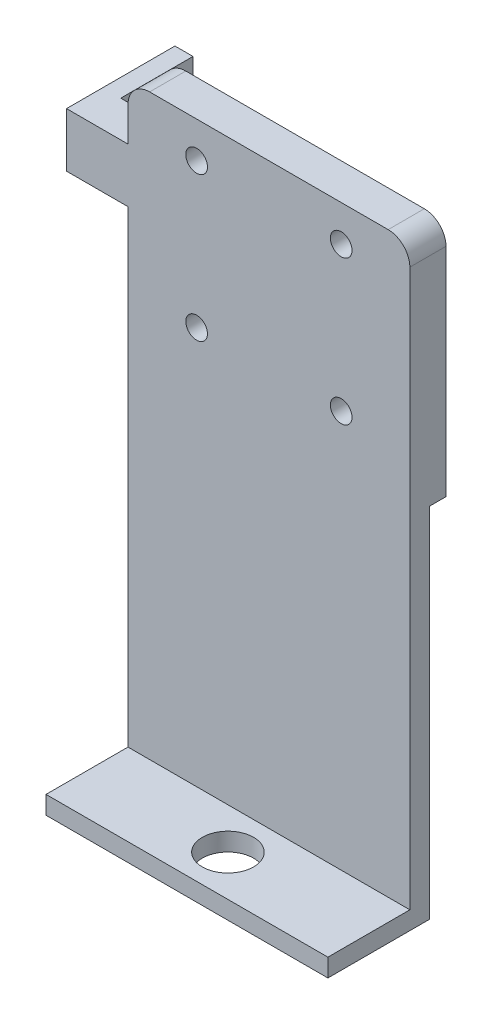
ISO-10303-21;
HEADER;
FILE_DESCRIPTION(('STEP AP214'),'2;1');
FILE_NAME('part.step','',(''),(''),'','','');
FILE_SCHEMA(('AUTOMOTIVE_DESIGN { 1 0 10303 214 1 1 1 1 }'));
ENDSEC;
DATA;
#1=APPLICATION_CONTEXT('core data for automotive mechanical design processes');
#2=APPLICATION_PROTOCOL_DEFINITION('international standard','automotive_design',2000,#1);
#3=PRODUCT_CONTEXT('',#1,'mechanical');
#4=PRODUCT('Part','Part','',(#3));
#5=PRODUCT_RELATED_PRODUCT_CATEGORY('part','',(#4));
#6=PRODUCT_DEFINITION_FORMATION('','',#4);
#7=PRODUCT_DEFINITION_CONTEXT('part definition',#1,'design');
#8=PRODUCT_DEFINITION('design','',#6,#7);
#9=PRODUCT_DEFINITION_SHAPE('','',#8);
#10=(LENGTH_UNIT() NAMED_UNIT(*) SI_UNIT(.MILLI.,.METRE.));
#11=(NAMED_UNIT(*) PLANE_ANGLE_UNIT() SI_UNIT($,.RADIAN.));
#12=(NAMED_UNIT(*) SI_UNIT($,.STERADIAN.) SOLID_ANGLE_UNIT());
#13=UNCERTAINTY_MEASURE_WITH_UNIT(LENGTH_MEASURE(1.E-05),#10,'distance_accuracy_value','');
#14=(GEOMETRIC_REPRESENTATION_CONTEXT(3) GLOBAL_UNCERTAINTY_ASSIGNED_CONTEXT((#13)) GLOBAL_UNIT_ASSIGNED_CONTEXT((#10,
#11,#12)) REPRESENTATION_CONTEXT('',''));
#15=CARTESIAN_POINT('',(0.,0.,0.));
#16=DIRECTION('',(0.,0.,1.));
#17=DIRECTION('',(1.,0.,0.));
#18=AXIS2_PLACEMENT_3D('',#15,#16,#17);
#19=CARTESIAN_POINT('',(0.,0.,10.));
#20=DIRECTION('',(0.,0.,1.));
#21=DIRECTION('',(1.,0.,0.));
#22=AXIS2_PLACEMENT_3D('',#19,#20,#21);
#23=PLANE('',#22);
#24=CARTESIAN_POINT('',(59.,-50.,10.));
#25=DIRECTION('',(0.,0.,1.));
#26=DIRECTION('',(-1.,0.,0.));
#27=AXIS2_PLACEMENT_3D('',#24,#25,#26);
#28=CIRCLE('',#27,3.00000000000001);
#29=CARTESIAN_POINT('',(56.,-50.,10.));
#30=VERTEX_POINT('',#29);
#31=EDGE_CURVE('E231',#30,#30,#28,.T.);
#32=ORIENTED_EDGE('',*,*,#31,.F.);
#33=EDGE_LOOP('',(#32));
#34=FACE_BOUND('',#33,.T.);
#35=CARTESIAN_POINT('',(19.,-9.99999999999999,10.));
#36=DIRECTION('',(0.,0.,1.));
#37=DIRECTION('',(1.,0.,0.));
#38=AXIS2_PLACEMENT_3D('',#35,#36,#37);
#39=CIRCLE('',#38,2.99999999999999);
#40=CARTESIAN_POINT('',(22.,-9.99999999999999,10.));
#41=VERTEX_POINT('',#40);
#42=EDGE_CURVE('E243',#41,#41,#39,.T.);
#43=ORIENTED_EDGE('',*,*,#42,.F.);
#44=EDGE_LOOP('',(#43));
#45=FACE_BOUND('',#44,.T.);
#46=CARTESIAN_POINT('',(19.,-50.,10.));
#47=DIRECTION('',(0.,0.,1.));
#48=DIRECTION('',(1.,0.,0.));
#49=AXIS2_PLACEMENT_3D('',#46,#47,#48);
#50=CIRCLE('',#49,2.99999999999999);
#51=CARTESIAN_POINT('',(22.,-50.,10.));
#52=VERTEX_POINT('',#51);
#53=EDGE_CURVE('E237',#52,#52,#50,.T.);
#54=ORIENTED_EDGE('',*,*,#53,.F.);
#55=EDGE_LOOP('',(#54));
#56=FACE_BOUND('',#55,.T.);
#57=CARTESIAN_POINT('',(59.,-9.99999999999998,10.));
#58=DIRECTION('',(0.,0.,1.));
#59=DIRECTION('',(-1.,0.,0.));
#60=AXIS2_PLACEMENT_3D('',#57,#58,#59);
#61=CIRCLE('',#60,2.99999999999999);
#62=CARTESIAN_POINT('',(56.,-9.99999999999998,10.));
#63=VERTEX_POINT('',#62);
#64=EDGE_CURVE('E225',#63,#63,#61,.T.);
#65=ORIENTED_EDGE('',*,*,#64,.F.);
#66=EDGE_LOOP('',(#65));
#67=FACE_BOUND('',#66,.T.);
#68=DIRECTION('',(0.,-1.,0.));
#69=VECTOR('',#68,1.);
#70=CARTESIAN_POINT('',(0.,-30.5,10.));
#71=LINE('',#70,#69);
#72=CARTESIAN_POINT('',(0.,-30.5,10.));
#73=VERTEX_POINT('',#72);
#74=CARTESIAN_POINT('',(0.,-160.,10.));
#75=VERTEX_POINT('',#74);
#76=EDGE_CURVE('E259',#73,#75,#71,.T.);
#77=ORIENTED_EDGE('',*,*,#76,.T.);
#78=DIRECTION('',(1.,0.,0.));
#79=VECTOR('',#78,1.);
#80=CARTESIAN_POINT('',(0.,-160.,10.));
#81=LINE('',#80,#79);
#82=CARTESIAN_POINT('',(78.,-160.,10.));
#83=VERTEX_POINT('',#82);
#84=EDGE_CURVE('E199',#75,#83,#81,.T.);
#85=ORIENTED_EDGE('',*,*,#84,.T.);
#86=DIRECTION('',(0.,1.,0.));
#87=VECTOR('',#86,1.);
#88=CARTESIAN_POINT('',(78.,0.,10.));
#89=LINE('',#88,#87);
#90=CARTESIAN_POINT('',(78.,-5.99999999999999,10.));
#91=VERTEX_POINT('',#90);
#92=EDGE_CURVE('E263',#83,#91,#89,.T.);
#93=ORIENTED_EDGE('',*,*,#92,.T.);
#94=CARTESIAN_POINT('',(72.,-5.99999999999999,10.));
#95=DIRECTION('',(0.,0.,1.));
#96=DIRECTION('',(1.,0.,0.));
#97=AXIS2_PLACEMENT_3D('',#94,#95,#96);
#98=CIRCLE('',#97,6.);
#99=CARTESIAN_POINT('',(72.,0.,10.));
#100=VERTEX_POINT('',#99);
#101=EDGE_CURVE('E11',#91,#100,#98,.T.);
#102=ORIENTED_EDGE('',*,*,#101,.T.);
#103=DIRECTION('',(-1.,0.,0.));
#104=VECTOR('',#103,1.);
#105=CARTESIAN_POINT('',(0.,0.,10.));
#106=LINE('',#105,#104);
#107=CARTESIAN_POINT('',(6.,0.,10.));
#108=VERTEX_POINT('',#107);
#109=EDGE_CURVE('E265',#100,#108,#106,.T.);
#110=ORIENTED_EDGE('',*,*,#109,.T.);
#111=CARTESIAN_POINT('',(6.,-6.,10.));
#112=DIRECTION('',(0.,0.,1.));
#113=DIRECTION('',(1.,0.,0.));
#114=AXIS2_PLACEMENT_3D('',#111,#112,#113);
#115=CIRCLE('',#114,6.);
#116=CARTESIAN_POINT('',(0.,-6.,10.));
#117=VERTEX_POINT('',#116);
#118=EDGE_CURVE('E303',#108,#117,#115,.T.);
#119=ORIENTED_EDGE('',*,*,#118,.T.);
#120=DIRECTION('',(0.,-1.,0.));
#121=VECTOR('',#120,1.);
#122=CARTESIAN_POINT('',(0.,0.,10.));
#123=LINE('',#122,#121);
#124=CARTESIAN_POINT('',(0.,-15.5,10.));
#125=VERTEX_POINT('',#124);
#126=EDGE_CURVE('E249',#117,#125,#123,.T.);
#127=ORIENTED_EDGE('',*,*,#126,.T.);
#128=DIRECTION('',(-1.,0.,0.));
#129=VECTOR('',#128,1.);
#130=CARTESIAN_POINT('',(-17.,-15.5,10.));
#131=LINE('',#130,#129);
#132=CARTESIAN_POINT('',(-17.,-15.5,10.));
#133=VERTEX_POINT('',#132);
#134=EDGE_CURVE('E252',#125,#133,#131,.T.);
#135=ORIENTED_EDGE('',*,*,#134,.T.);
#136=DIRECTION('',(0.,-1.,0.));
#137=VECTOR('',#136,1.);
#138=CARTESIAN_POINT('',(-17.,-30.5,10.));
#139=LINE('',#138,#137);
#140=CARTESIAN_POINT('',(-17.,-30.5,10.));
#141=VERTEX_POINT('',#140);
#142=EDGE_CURVE('E255',#133,#141,#139,.T.);
#143=ORIENTED_EDGE('',*,*,#142,.T.);
#144=DIRECTION('',(1.,0.,0.));
#145=VECTOR('',#144,1.);
#146=CARTESIAN_POINT('',(-9.99999999999999,-30.5,10.));
#147=LINE('',#146,#145);
#148=EDGE_CURVE('E257',#141,#73,#147,.T.);
#149=ORIENTED_EDGE('',*,*,#148,.T.);
#150=EDGE_LOOP('',(#77,#85,#93,#102,#110,#119,#127,#135,#143,#149));
#151=FACE_BOUND('',#150,.T.);
#152=ADVANCED_FACE('F43',(#34,#45,#56,#67,#151),#23,.T.);
#153=CARTESIAN_POINT('',(78.,-66.,10.));
#154=DIRECTION('',(0.,1.,0.));
#155=DIRECTION('',(-1.,0.,0.));
#156=AXIS2_PLACEMENT_3D('',#153,#154,#155);
#157=PLANE('',#156);
#158=DIRECTION('',(1.,0.,0.));
#159=VECTOR('',#158,1.);
#160=CARTESIAN_POINT('',(0.,-66.,4.5));
#161=LINE('',#160,#159);
#162=CARTESIAN_POINT('',(0.,-66.,4.5));
#163=VERTEX_POINT('',#162);
#164=CARTESIAN_POINT('',(78.,-66.,4.5));
#165=VERTEX_POINT('',#164);
#166=EDGE_CURVE('E217',#163,#165,#161,.T.);
#167=ORIENTED_EDGE('',*,*,#166,.F.);
#168=DIRECTION('',(0.,0.,-1.));
#169=VECTOR('',#168,1.);
#170=CARTESIAN_POINT('',(0.,-66.,10.));
#171=LINE('',#170,#169);
#172=CARTESIAN_POINT('',(0.,-66.,0.));
#173=VERTEX_POINT('',#172);
#174=EDGE_CURVE('E283',#163,#173,#171,.T.);
#175=ORIENTED_EDGE('',*,*,#174,.T.);
#176=DIRECTION('',(1.,0.,0.));
#177=VECTOR('',#176,1.);
#178=CARTESIAN_POINT('',(78.,-66.,0.));
#179=LINE('',#178,#177);
#180=CARTESIAN_POINT('',(78.,-66.,0.));
#181=VERTEX_POINT('',#180);
#182=EDGE_CURVE('E275',#173,#181,#179,.T.);
#183=ORIENTED_EDGE('',*,*,#182,.T.);
#184=DIRECTION('',(0.,0.,-1.));
#185=VECTOR('',#184,1.);
#186=CARTESIAN_POINT('',(78.,-66.,10.));
#187=LINE('',#186,#185);
#188=EDGE_CURVE('E267',#165,#181,#187,.T.);
#189=ORIENTED_EDGE('',*,*,#188,.F.);
#190=EDGE_LOOP('',(#167,#175,#183,#189));
#191=FACE_BOUND('',#190,.T.);
#192=ADVANCED_FACE('F363',(#191),#157,.F.);
#193=CARTESIAN_POINT('',(0.,0.,0.));
#194=DIRECTION('',(0.,0.,1.));
#195=DIRECTION('',(1.,0.,0.));
#196=AXIS2_PLACEMENT_3D('',#193,#194,#195);
#197=PLANE('',#196);
#198=DIRECTION('',(1.,0.,0.));
#199=VECTOR('',#198,1.);
#200=CARTESIAN_POINT('',(0.,-30.5,0.));
#201=LINE('',#200,#199);
#202=CARTESIAN_POINT('',(-12.,-30.5,0.));
#203=VERTEX_POINT('',#202);
#204=CARTESIAN_POINT('',(0.,-30.5,0.));
#205=VERTEX_POINT('',#204);
#206=EDGE_CURVE('E270',#203,#205,#201,.T.);
#207=ORIENTED_EDGE('',*,*,#206,.F.);
#208=DIRECTION('',(0.,1.,0.));
#209=VECTOR('',#208,1.);
#210=CARTESIAN_POINT('',(-12.,-15.5,0.));
#211=LINE('',#210,#209);
#212=CARTESIAN_POINT('',(-12.,-15.5,0.));
#213=VERTEX_POINT('',#212);
#214=EDGE_CURVE('E179',#203,#213,#211,.T.);
#215=ORIENTED_EDGE('',*,*,#214,.T.);
#216=DIRECTION('',(-1.,0.,0.));
#217=VECTOR('',#216,1.);
#218=CARTESIAN_POINT('',(-17.,-15.5,0.));
#219=LINE('',#218,#217);
#220=CARTESIAN_POINT('',(0.,-15.5,0.));
#221=VERTEX_POINT('',#220);
#222=EDGE_CURVE('E178',#221,#213,#219,.T.);
#223=ORIENTED_EDGE('',*,*,#222,.F.);
#224=DIRECTION('',(0.,-1.,0.));
#225=VECTOR('',#224,1.);
#226=CARTESIAN_POINT('',(0.,0.,0.));
#227=LINE('',#226,#225);
#228=CARTESIAN_POINT('',(0.,-6.,0.));
#229=VERTEX_POINT('',#228);
#230=EDGE_CURVE('E246',#229,#221,#227,.T.);
#231=ORIENTED_EDGE('',*,*,#230,.F.);
#232=CARTESIAN_POINT('',(6.,-6.,0.));
#233=DIRECTION('',(0.,0.,1.));
#234=DIRECTION('',(1.,0.,0.));
#235=AXIS2_PLACEMENT_3D('',#232,#233,#234);
#236=CIRCLE('',#235,6.);
#237=CARTESIAN_POINT('',(6.,0.,0.));
#238=VERTEX_POINT('',#237);
#239=EDGE_CURVE('E297',#229,#238,#236,.F.);
#240=ORIENTED_EDGE('',*,*,#239,.T.);
#241=DIRECTION('',(-1.,0.,0.));
#242=VECTOR('',#241,1.);
#243=CARTESIAN_POINT('',(0.,0.,0.));
#244=LINE('',#243,#242);
#245=CARTESIAN_POINT('',(72.,0.,0.));
#246=VERTEX_POINT('',#245);
#247=EDGE_CURVE('E253',#246,#238,#244,.T.);
#248=ORIENTED_EDGE('',*,*,#247,.F.);
#249=CARTESIAN_POINT('',(72.,-5.99999999999999,0.));
#250=DIRECTION('',(0.,0.,1.));
#251=DIRECTION('',(1.,0.,0.));
#252=AXIS2_PLACEMENT_3D('',#249,#250,#251);
#253=CIRCLE('',#252,6.);
#254=CARTESIAN_POINT('',(78.,-5.99999999999999,0.));
#255=VERTEX_POINT('',#254);
#256=EDGE_CURVE('E308',#246,#255,#253,.F.);
#257=ORIENTED_EDGE('',*,*,#256,.T.);
#258=DIRECTION('',(0.,1.,0.));
#259=VECTOR('',#258,1.);
#260=CARTESIAN_POINT('',(78.,0.,0.));
#261=LINE('',#260,#259);
#262=EDGE_CURVE('E278',#181,#255,#261,.T.);
#263=ORIENTED_EDGE('',*,*,#262,.F.);
#264=ORIENTED_EDGE('',*,*,#182,.F.);
#265=DIRECTION('',(0.,-1.,0.));
#266=VECTOR('',#265,1.);
#267=CARTESIAN_POINT('',(0.,-30.5,0.));
#268=LINE('',#267,#266);
#269=EDGE_CURVE('E272',#205,#173,#268,.T.);
#270=ORIENTED_EDGE('',*,*,#269,.F.);
#271=EDGE_LOOP('',(#207,#215,#223,#231,#240,#248,#257,#263,#264,#270));
#272=FACE_BOUND('',#271,.T.);
#273=CARTESIAN_POINT('',(19.,-9.99999999999999,0.));
#274=DIRECTION('',(0.,0.,1.));
#275=DIRECTION('',(1.,0.,0.));
#276=AXIS2_PLACEMENT_3D('',#273,#274,#275);
#277=CIRCLE('',#276,2.99999999999999);
#278=CARTESIAN_POINT('',(22.,-9.99999999999999,0.));
#279=VERTEX_POINT('',#278);
#280=EDGE_CURVE('E240',#279,#279,#277,.T.);
#281=ORIENTED_EDGE('',*,*,#280,.T.);
#282=EDGE_LOOP('',(#281));
#283=FACE_BOUND('',#282,.T.);
#284=CARTESIAN_POINT('',(19.,-50.,0.));
#285=DIRECTION('',(0.,0.,1.));
#286=DIRECTION('',(1.,0.,0.));
#287=AXIS2_PLACEMENT_3D('',#284,#285,#286);
#288=CIRCLE('',#287,2.99999999999999);
#289=CARTESIAN_POINT('',(22.,-50.,0.));
#290=VERTEX_POINT('',#289);
#291=EDGE_CURVE('E234',#290,#290,#288,.T.);
#292=ORIENTED_EDGE('',*,*,#291,.T.);
#293=EDGE_LOOP('',(#292));
#294=FACE_BOUND('',#293,.T.);
#295=CARTESIAN_POINT('',(59.,-50.,0.));
#296=DIRECTION('',(0.,0.,1.));
#297=DIRECTION('',(-1.,0.,0.));
#298=AXIS2_PLACEMENT_3D('',#295,#296,#297);
#299=CIRCLE('',#298,3.00000000000001);
#300=CARTESIAN_POINT('',(56.,-50.,0.));
#301=VERTEX_POINT('',#300);
#302=EDGE_CURVE('E228',#301,#301,#299,.T.);
#303=ORIENTED_EDGE('',*,*,#302,.T.);
#304=EDGE_LOOP('',(#303));
#305=FACE_BOUND('',#304,.T.);
#306=CARTESIAN_POINT('',(59.,-9.99999999999998,0.));
#307=DIRECTION('',(0.,0.,1.));
#308=DIRECTION('',(-1.,0.,0.));
#309=AXIS2_PLACEMENT_3D('',#306,#307,#308);
#310=CIRCLE('',#309,2.99999999999999);
#311=CARTESIAN_POINT('',(56.,-9.99999999999998,0.));
#312=VERTEX_POINT('',#311);
#313=EDGE_CURVE('E223',#312,#312,#310,.T.);
#314=ORIENTED_EDGE('',*,*,#313,.T.);
#315=EDGE_LOOP('',(#314));
#316=FACE_BOUND('',#315,.T.);
#317=ADVANCED_FACE('F365',(#272,#283,#294,#305,#316),#197,.F.);
#318=CARTESIAN_POINT('',(0.,0.,10.));
#319=DIRECTION('',(1.,0.,0.));
#320=DIRECTION('',(0.,1.,0.));
#321=AXIS2_PLACEMENT_3D('',#318,#319,#320);
#322=PLANE('',#321);
#323=ORIENTED_EDGE('',*,*,#126,.F.);
#324=DIRECTION('',(0.,0.,-1.));
#325=VECTOR('',#324,1.);
#326=CARTESIAN_POINT('',(0.,-6.,10.));
#327=LINE('',#326,#325);
#328=EDGE_CURVE('E294',#117,#229,#327,.T.);
#329=ORIENTED_EDGE('',*,*,#328,.T.);
#330=ORIENTED_EDGE('',*,*,#230,.T.);
#331=DIRECTION('',(0.,0.,-1.));
#332=VECTOR('',#331,1.);
#333=CARTESIAN_POINT('',(0.,-15.5,10.));
#334=LINE('',#333,#332);
#335=EDGE_CURVE('E292',#125,#221,#334,.T.);
#336=ORIENTED_EDGE('',*,*,#335,.F.);
#337=EDGE_LOOP('',(#323,#329,#330,#336));
#338=FACE_BOUND('',#337,.T.);
#339=ADVANCED_FACE('F332',(#338),#322,.F.);
#340=CARTESIAN_POINT('',(-17.,-15.5,10.));
#341=DIRECTION('',(0.,-1.,0.));
#342=DIRECTION('',(1.,0.,0.));
#343=AXIS2_PLACEMENT_3D('',#340,#341,#342);
#344=PLANE('',#343);
#345=ORIENTED_EDGE('',*,*,#222,.T.);
#346=DIRECTION('',(0.,0.,-1.));
#347=VECTOR('',#346,1.);
#348=CARTESIAN_POINT('',(-12.,-15.5,0.));
#349=LINE('',#348,#347);
#350=CARTESIAN_POINT('',(-12.,-15.5,-20.));
#351=VERTEX_POINT('',#350);
#352=EDGE_CURVE('E58',#213,#351,#349,.T.);
#353=ORIENTED_EDGE('',*,*,#352,.T.);
#354=DIRECTION('',(-1.,0.,0.));
#355=VECTOR('',#354,1.);
#356=CARTESIAN_POINT('',(-12.,-15.5,-20.));
#357=LINE('',#356,#355);
#358=CARTESIAN_POINT('',(-17.,-15.5,-20.));
#359=VERTEX_POINT('',#358);
#360=EDGE_CURVE('E159',#351,#359,#357,.T.);
#361=ORIENTED_EDGE('',*,*,#360,.T.);
#362=DIRECTION('',(0.,0.,-1.));
#363=VECTOR('',#362,1.);
#364=CARTESIAN_POINT('',(-17.,-15.5,10.));
#365=LINE('',#364,#363);
#366=EDGE_CURVE('E290',#133,#359,#365,.T.);
#367=ORIENTED_EDGE('',*,*,#366,.F.);
#368=ORIENTED_EDGE('',*,*,#134,.F.);
#369=ORIENTED_EDGE('',*,*,#335,.T.);
#370=EDGE_LOOP('',(#345,#353,#361,#367,#368,#369));
#371=FACE_BOUND('',#370,.T.);
#372=ADVANCED_FACE('F175',(#371),#344,.F.);
#373=CARTESIAN_POINT('',(-17.,-30.5,10.));
#374=DIRECTION('',(1.,0.,0.));
#375=DIRECTION('',(0.,1.,0.));
#376=AXIS2_PLACEMENT_3D('',#373,#374,#375);
#377=PLANE('',#376);
#378=ORIENTED_EDGE('',*,*,#366,.T.);
#379=DIRECTION('',(0.,-1.,0.));
#380=VECTOR('',#379,1.);
#381=CARTESIAN_POINT('',(-17.,-30.5,-20.));
#382=LINE('',#381,#380);
#383=CARTESIAN_POINT('',(-17.,-30.5,-20.));
#384=VERTEX_POINT('',#383);
#385=EDGE_CURVE('E165',#359,#384,#382,.T.);
#386=ORIENTED_EDGE('',*,*,#385,.T.);
#387=DIRECTION('',(0.,0.,-1.));
#388=VECTOR('',#387,1.);
#389=CARTESIAN_POINT('',(-17.,-30.5,10.));
#390=LINE('',#389,#388);
#391=EDGE_CURVE('E288',#141,#384,#390,.T.);
#392=ORIENTED_EDGE('',*,*,#391,.F.);
#393=ORIENTED_EDGE('',*,*,#142,.F.);
#394=EDGE_LOOP('',(#378,#386,#392,#393));
#395=FACE_BOUND('',#394,.T.);
#396=ADVANCED_FACE('F339',(#395),#377,.F.);
#397=CARTESIAN_POINT('',(0.,-30.5,10.));
#398=DIRECTION('',(0.,1.,0.));
#399=DIRECTION('',(0.,0.,1.));
#400=AXIS2_PLACEMENT_3D('',#397,#398,#399);
#401=PLANE('',#400);
#402=ORIENTED_EDGE('',*,*,#391,.T.);
#403=DIRECTION('',(-1.,0.,0.));
#404=VECTOR('',#403,1.);
#405=CARTESIAN_POINT('',(-12.,-30.5,-20.));
#406=LINE('',#405,#404);
#407=CARTESIAN_POINT('',(-12.,-30.5,-20.));
#408=VERTEX_POINT('',#407);
#409=EDGE_CURVE('E168',#408,#384,#406,.T.);
#410=ORIENTED_EDGE('',*,*,#409,.F.);
#411=DIRECTION('',(0.,0.,1.));
#412=VECTOR('',#411,1.);
#413=CARTESIAN_POINT('',(-12.,-30.5,0.));
#414=LINE('',#413,#412);
#415=EDGE_CURVE('E169',#408,#203,#414,.T.);
#416=ORIENTED_EDGE('',*,*,#415,.T.);
#417=ORIENTED_EDGE('',*,*,#206,.T.);
#418=DIRECTION('',(0.,0.,-1.));
#419=VECTOR('',#418,1.);
#420=CARTESIAN_POINT('',(0.,-30.5,10.));
#421=LINE('',#420,#419);
#422=EDGE_CURVE('E285',#73,#205,#421,.T.);
#423=ORIENTED_EDGE('',*,*,#422,.F.);
#424=ORIENTED_EDGE('',*,*,#148,.F.);
#425=EDGE_LOOP('',(#402,#410,#416,#417,#423,#424));
#426=FACE_BOUND('',#425,.T.);
#427=ADVANCED_FACE('F341',(#426),#401,.F.);
#428=CARTESIAN_POINT('',(0.,-30.5,10.));
#429=DIRECTION('',(1.,0.,0.));
#430=DIRECTION('',(0.,1.,0.));
#431=AXIS2_PLACEMENT_3D('',#428,#429,#430);
#432=PLANE('',#431);
#433=ORIENTED_EDGE('',*,*,#269,.T.);
#434=ORIENTED_EDGE('',*,*,#174,.F.);
#435=DIRECTION('',(0.,-1.,0.));
#436=VECTOR('',#435,1.);
#437=CARTESIAN_POINT('',(0.,-66.,4.5));
#438=LINE('',#437,#436);
#439=CARTESIAN_POINT('',(0.,-165.,4.5));
#440=VERTEX_POINT('',#439);
#441=EDGE_CURVE('E209',#163,#440,#438,.T.);
#442=ORIENTED_EDGE('',*,*,#441,.T.);
#443=DIRECTION('',(0.,0.,1.));
#444=VECTOR('',#443,1.);
#445=CARTESIAN_POINT('',(0.,-165.,4.5));
#446=LINE('',#445,#444);
#447=CARTESIAN_POINT('',(0.,-165.,32.6799821551631));
#448=VERTEX_POINT('',#447);
#449=EDGE_CURVE('E220',#440,#448,#446,.T.);
#450=ORIENTED_EDGE('',*,*,#449,.T.);
#451=DIRECTION('',(0.,-1.,0.));
#452=VECTOR('',#451,1.);
#453=CARTESIAN_POINT('',(0.,-160.,32.6799821551631));
#454=LINE('',#453,#452);
#455=CARTESIAN_POINT('',(0.,-160.,32.6799821551631));
#456=VERTEX_POINT('',#455);
#457=EDGE_CURVE('E206',#456,#448,#454,.T.);
#458=ORIENTED_EDGE('',*,*,#457,.F.);
#459=DIRECTION('',(0.,0.,1.));
#460=VECTOR('',#459,1.);
#461=CARTESIAN_POINT('',(0.,-160.,10.));
#462=LINE('',#461,#460);
#463=EDGE_CURVE('E193',#75,#456,#462,.T.);
#464=ORIENTED_EDGE('',*,*,#463,.F.);
#465=ORIENTED_EDGE('',*,*,#76,.F.);
#466=ORIENTED_EDGE('',*,*,#422,.T.);
#467=EDGE_LOOP('',(#433,#434,#442,#450,#458,#464,#465,#466));
#468=FACE_BOUND('',#467,.T.);
#469=ADVANCED_FACE('F346',(#468),#432,.F.);
#470=CARTESIAN_POINT('',(78.,0.,10.));
#471=DIRECTION('',(-1.,0.,0.));
#472=DIRECTION('',(0.,-1.,0.));
#473=AXIS2_PLACEMENT_3D('',#470,#471,#472);
#474=PLANE('',#473);
#475=ORIENTED_EDGE('',*,*,#262,.T.);
#476=DIRECTION('',(0.,0.,-1.));
#477=VECTOR('',#476,1.);
#478=CARTESIAN_POINT('',(78.,-5.99999999999999,10.));
#479=LINE('',#478,#477);
#480=EDGE_CURVE('E51',#255,#91,#479,.F.);
#481=ORIENTED_EDGE('',*,*,#480,.T.);
#482=ORIENTED_EDGE('',*,*,#92,.F.);
#483=DIRECTION('',(0.,0.,1.));
#484=VECTOR('',#483,1.);
#485=CARTESIAN_POINT('',(78.,-160.,10.));
#486=LINE('',#485,#484);
#487=CARTESIAN_POINT('',(78.,-160.,32.6799821551631));
#488=VERTEX_POINT('',#487);
#489=EDGE_CURVE('E66',#83,#488,#486,.T.);
#490=ORIENTED_EDGE('',*,*,#489,.T.);
#491=DIRECTION('',(0.,-1.,0.));
#492=VECTOR('',#491,1.);
#493=CARTESIAN_POINT('',(78.,-160.,32.6799821551631));
#494=LINE('',#493,#492);
#495=CARTESIAN_POINT('',(78.,-165.,32.6799821551631));
#496=VERTEX_POINT('',#495);
#497=EDGE_CURVE('E201',#488,#496,#494,.T.);
#498=ORIENTED_EDGE('',*,*,#497,.T.);
#499=DIRECTION('',(0.,0.,1.));
#500=VECTOR('',#499,1.);
#501=CARTESIAN_POINT('',(78.,-165.,4.5));
#502=LINE('',#501,#500);
#503=CARTESIAN_POINT('',(78.,-165.,4.5));
#504=VERTEX_POINT('',#503);
#505=EDGE_CURVE('E221',#504,#496,#502,.T.);
#506=ORIENTED_EDGE('',*,*,#505,.F.);
#507=DIRECTION('',(0.,-1.,0.));
#508=VECTOR('',#507,1.);
#509=CARTESIAN_POINT('',(78.,-66.,4.5));
#510=LINE('',#509,#508);
#511=EDGE_CURVE('E215',#165,#504,#510,.T.);
#512=ORIENTED_EDGE('',*,*,#511,.F.);
#513=ORIENTED_EDGE('',*,*,#188,.T.);
#514=EDGE_LOOP('',(#475,#481,#482,#490,#498,#506,#512,#513));
#515=FACE_BOUND('',#514,.T.);
#516=ADVANCED_FACE('F314',(#515),#474,.F.);
#517=CARTESIAN_POINT('',(0.,0.,10.));
#518=DIRECTION('',(0.,-1.,0.));
#519=DIRECTION('',(1.,0.,0.));
#520=AXIS2_PLACEMENT_3D('',#517,#518,#519);
#521=PLANE('',#520);
#522=ORIENTED_EDGE('',*,*,#109,.F.);
#523=DIRECTION('',(0.,0.,-1.));
#524=VECTOR('',#523,1.);
#525=CARTESIAN_POINT('',(72.,0.,10.));
#526=LINE('',#525,#524);
#527=EDGE_CURVE('E305',#100,#246,#526,.T.);
#528=ORIENTED_EDGE('',*,*,#527,.T.);
#529=ORIENTED_EDGE('',*,*,#247,.T.);
#530=DIRECTION('',(0.,0.,-1.));
#531=VECTOR('',#530,1.);
#532=CARTESIAN_POINT('',(6.,0.,10.));
#533=LINE('',#532,#531);
#534=EDGE_CURVE('E300',#238,#108,#533,.F.);
#535=ORIENTED_EDGE('',*,*,#534,.T.);
#536=EDGE_LOOP('',(#522,#528,#529,#535));
#537=FACE_BOUND('',#536,.T.);
#538=ADVANCED_FACE('F321',(#537),#521,.F.);
#539=CARTESIAN_POINT('',(19.,-9.99999999999999,10.));
#540=DIRECTION('',(0.,0.,-1.));
#541=DIRECTION('',(-1.,0.,0.));
#542=AXIS2_PLACEMENT_3D('',#539,#540,#541);
#543=CYLINDRICAL_SURFACE('',#542,2.99999999999999);
#544=ORIENTED_EDGE('',*,*,#42,.T.);
#545=EDGE_LOOP('',(#544));
#546=FACE_BOUND('',#545,.T.);
#547=ORIENTED_EDGE('',*,*,#280,.F.);
#548=EDGE_LOOP('',(#547));
#549=FACE_BOUND('',#548,.T.);
#550=ADVANCED_FACE('F400',(#546,#549),#543,.F.);
#551=CARTESIAN_POINT('',(19.,-50.,10.));
#552=DIRECTION('',(0.,0.,-1.));
#553=DIRECTION('',(-1.,0.,0.));
#554=AXIS2_PLACEMENT_3D('',#551,#552,#553);
#555=CYLINDRICAL_SURFACE('',#554,2.99999999999999);
#556=ORIENTED_EDGE('',*,*,#53,.T.);
#557=EDGE_LOOP('',(#556));
#558=FACE_BOUND('',#557,.T.);
#559=ORIENTED_EDGE('',*,*,#291,.F.);
#560=EDGE_LOOP('',(#559));
#561=FACE_BOUND('',#560,.T.);
#562=ADVANCED_FACE('F386',(#558,#561),#555,.F.);
#563=CARTESIAN_POINT('',(59.,-50.,10.));
#564=DIRECTION('',(0.,0.,-1.));
#565=DIRECTION('',(-1.,0.,0.));
#566=AXIS2_PLACEMENT_3D('',#563,#564,#565);
#567=CYLINDRICAL_SURFACE('',#566,3.00000000000001);
#568=ORIENTED_EDGE('',*,*,#31,.T.);
#569=EDGE_LOOP('',(#568));
#570=FACE_BOUND('',#569,.T.);
#571=ORIENTED_EDGE('',*,*,#302,.F.);
#572=EDGE_LOOP('',(#571));
#573=FACE_BOUND('',#572,.T.);
#574=ADVANCED_FACE('F379',(#570,#573),#567,.F.);
#575=CARTESIAN_POINT('',(59.,-9.99999999999998,10.));
#576=DIRECTION('',(0.,0.,-1.));
#577=DIRECTION('',(-1.,0.,0.));
#578=AXIS2_PLACEMENT_3D('',#575,#576,#577);
#579=CYLINDRICAL_SURFACE('',#578,2.99999999999999);
#580=ORIENTED_EDGE('',*,*,#64,.T.);
#581=EDGE_LOOP('',(#580));
#582=FACE_BOUND('',#581,.T.);
#583=ORIENTED_EDGE('',*,*,#313,.F.);
#584=EDGE_LOOP('',(#583));
#585=FACE_BOUND('',#584,.T.);
#586=ADVANCED_FACE('F377',(#582,#585),#579,.F.);
#587=CARTESIAN_POINT('',(6.,-6.,10.));
#588=DIRECTION('',(0.,0.,-1.));
#589=DIRECTION('',(-1.,0.,0.));
#590=AXIS2_PLACEMENT_3D('',#587,#588,#589);
#591=CYLINDRICAL_SURFACE('',#590,6.);
#592=ORIENTED_EDGE('',*,*,#118,.F.);
#593=ORIENTED_EDGE('',*,*,#534,.F.);
#594=ORIENTED_EDGE('',*,*,#239,.F.);
#595=ORIENTED_EDGE('',*,*,#328,.F.);
#596=EDGE_LOOP('',(#592,#593,#594,#595));
#597=FACE_BOUND('',#596,.T.);
#598=ADVANCED_FACE('F327',(#597),#591,.T.);
#599=CARTESIAN_POINT('',(72.,-5.99999999999999,10.));
#600=DIRECTION('',(0.,0.,-1.));
#601=DIRECTION('',(-1.,0.,0.));
#602=AXIS2_PLACEMENT_3D('',#599,#600,#601);
#603=CYLINDRICAL_SURFACE('',#602,6.);
#604=ORIENTED_EDGE('',*,*,#101,.F.);
#605=ORIENTED_EDGE('',*,*,#480,.F.);
#606=ORIENTED_EDGE('',*,*,#256,.F.);
#607=ORIENTED_EDGE('',*,*,#527,.F.);
#608=EDGE_LOOP('',(#604,#605,#606,#607));
#609=FACE_BOUND('',#608,.T.);
#610=ADVANCED_FACE('F45',(#609),#603,.T.);
#611=CARTESIAN_POINT('',(0.,-165.,4.5));
#612=DIRECTION('',(0.,-1.,0.));
#613=DIRECTION('',(0.,0.,-1.));
#614=AXIS2_PLACEMENT_3D('',#611,#612,#613);
#615=PLANE('',#614);
#616=CARTESIAN_POINT('',(39.,-165.,21.3399910775816));
#617=DIRECTION('',(0.,-1.,0.));
#618=DIRECTION('',(0.,0.,-1.));
#619=AXIS2_PLACEMENT_3D('',#616,#617,#618);
#620=CIRCLE('',#619,7.1);
#621=CARTESIAN_POINT('',(39.,-165.,14.2399910775816));
#622=VERTEX_POINT('',#621);
#623=EDGE_CURVE('E189',#622,#622,#620,.T.);
#624=ORIENTED_EDGE('',*,*,#623,.F.);
#625=EDGE_LOOP('',(#624));
#626=FACE_BOUND('',#625,.T.);
#627=ORIENTED_EDGE('',*,*,#505,.T.);
#628=DIRECTION('',(-1.,0.,0.));
#629=VECTOR('',#628,1.);
#630=CARTESIAN_POINT('',(78.,-165.,32.6799821551631));
#631=LINE('',#630,#629);
#632=EDGE_CURVE('E192',#496,#448,#631,.T.);
#633=ORIENTED_EDGE('',*,*,#632,.T.);
#634=ORIENTED_EDGE('',*,*,#449,.F.);
#635=DIRECTION('',(1.,0.,0.));
#636=VECTOR('',#635,1.);
#637=CARTESIAN_POINT('',(0.,-165.,4.5));
#638=LINE('',#637,#636);
#639=EDGE_CURVE('E212',#440,#504,#638,.T.);
#640=ORIENTED_EDGE('',*,*,#639,.T.);
#641=EDGE_LOOP('',(#627,#633,#634,#640));
#642=FACE_BOUND('',#641,.T.);
#643=ADVANCED_FACE('F356',(#626,#642),#615,.T.);
#644=CARTESIAN_POINT('',(0.,0.,4.5));
#645=DIRECTION('',(0.,0.,1.));
#646=DIRECTION('',(1.,0.,0.));
#647=AXIS2_PLACEMENT_3D('',#644,#645,#646);
#648=PLANE('',#647);
#649=ORIENTED_EDGE('',*,*,#441,.F.);
#650=ORIENTED_EDGE('',*,*,#166,.T.);
#651=ORIENTED_EDGE('',*,*,#511,.T.);
#652=ORIENTED_EDGE('',*,*,#639,.F.);
#653=EDGE_LOOP('',(#649,#650,#651,#652));
#654=FACE_BOUND('',#653,.T.);
#655=ADVANCED_FACE('F359',(#654),#648,.F.);
#656=CARTESIAN_POINT('',(78.,-160.,32.6799821551631));
#657=DIRECTION('',(0.,0.,1.));
#658=DIRECTION('',(1.,0.,0.));
#659=AXIS2_PLACEMENT_3D('',#656,#657,#658);
#660=PLANE('',#659);
#661=ORIENTED_EDGE('',*,*,#632,.F.);
#662=ORIENTED_EDGE('',*,*,#497,.F.);
#663=DIRECTION('',(-1.,0.,0.));
#664=VECTOR('',#663,1.);
#665=CARTESIAN_POINT('',(78.,-160.,32.6799821551631));
#666=LINE('',#665,#664);
#667=EDGE_CURVE('E195',#488,#456,#666,.T.);
#668=ORIENTED_EDGE('',*,*,#667,.T.);
#669=ORIENTED_EDGE('',*,*,#457,.T.);
#670=EDGE_LOOP('',(#661,#662,#668,#669));
#671=FACE_BOUND('',#670,.T.);
#672=ADVANCED_FACE('F351',(#671),#660,.T.);
#673=CARTESIAN_POINT('',(0.,-160.,0.));
#674=DIRECTION('',(0.,-1.,0.));
#675=DIRECTION('',(0.,0.,-1.));
#676=AXIS2_PLACEMENT_3D('',#673,#674,#675);
#677=PLANE('',#676);
#678=CARTESIAN_POINT('',(39.,-160.,21.3399910775816));
#679=DIRECTION('',(0.,1.,0.));
#680=DIRECTION('',(0.,0.,1.));
#681=AXIS2_PLACEMENT_3D('',#678,#679,#680);
#682=CIRCLE('',#681,7.1);
#683=CARTESIAN_POINT('',(39.,-160.,28.4399910775816));
#684=VERTEX_POINT('',#683);
#685=EDGE_CURVE('E185',#684,#684,#682,.T.);
#686=ORIENTED_EDGE('',*,*,#685,.F.);
#687=EDGE_LOOP('',(#686));
#688=FACE_BOUND('',#687,.T.);
#689=ORIENTED_EDGE('',*,*,#463,.T.);
#690=ORIENTED_EDGE('',*,*,#667,.F.);
#691=ORIENTED_EDGE('',*,*,#489,.F.);
#692=ORIENTED_EDGE('',*,*,#84,.F.);
#693=EDGE_LOOP('',(#689,#690,#691,#692));
#694=FACE_BOUND('',#693,.T.);
#695=ADVANCED_FACE('F348',(#688,#694),#677,.F.);
#696=CARTESIAN_POINT('',(39.,-200.,21.3399910775816));
#697=DIRECTION('',(0.,1.,0.));
#698=DIRECTION('',(0.,0.,1.));
#699=AXIS2_PLACEMENT_3D('',#696,#697,#698);
#700=CYLINDRICAL_SURFACE('',#699,7.1);
#701=ORIENTED_EDGE('',*,*,#623,.T.);
#702=EDGE_LOOP('',(#701));
#703=FACE_BOUND('',#702,.T.);
#704=ORIENTED_EDGE('',*,*,#685,.T.);
#705=EDGE_LOOP('',(#704));
#706=FACE_BOUND('',#705,.T.);
#707=ADVANCED_FACE('F547',(#703,#706),#700,.F.);
#708=CARTESIAN_POINT('',(-12.,-30.5,-20.));
#709=DIRECTION('',(0.,0.,-1.));
#710=DIRECTION('',(-1.,0.,0.));
#711=AXIS2_PLACEMENT_3D('',#708,#709,#710);
#712=PLANE('',#711);
#713=ORIENTED_EDGE('',*,*,#385,.F.);
#714=ORIENTED_EDGE('',*,*,#360,.F.);
#715=DIRECTION('',(0.,-1.,0.));
#716=VECTOR('',#715,1.);
#717=CARTESIAN_POINT('',(-12.,-30.5,-20.));
#718=LINE('',#717,#716);
#719=EDGE_CURVE('E162',#351,#408,#718,.T.);
#720=ORIENTED_EDGE('',*,*,#719,.T.);
#721=ORIENTED_EDGE('',*,*,#409,.T.);
#722=EDGE_LOOP('',(#713,#714,#720,#721));
#723=FACE_BOUND('',#722,.T.);
#724=ADVANCED_FACE('F160',(#723),#712,.T.);
#725=CARTESIAN_POINT('',(-12.,0.,0.));
#726=DIRECTION('',(1.,0.,0.));
#727=DIRECTION('',(0.,1.,0.));
#728=AXIS2_PLACEMENT_3D('',#725,#726,#727);
#729=PLANE('',#728);
#730=ORIENTED_EDGE('',*,*,#214,.F.);
#731=ORIENTED_EDGE('',*,*,#415,.F.);
#732=ORIENTED_EDGE('',*,*,#719,.F.);
#733=ORIENTED_EDGE('',*,*,#352,.F.);
#734=EDGE_LOOP('',(#730,#731,#732,#733));
#735=FACE_BOUND('',#734,.T.);
#736=ADVANCED_FACE('F171',(#735),#729,.T.);
#737=CLOSED_SHELL('',(#152,#192,#317,#339,#372,#396,#427,#469,#516,#538,#550,#562,#574,#586,
#598,#610,#643,#655,#672,#695,#707,#724,#736));
#738=MANIFOLD_SOLID_BREP('B2',#737);
#739=ADVANCED_BREP_SHAPE_REPRESENTATION('',(#18,#738),#14);
#740=SHAPE_DEFINITION_REPRESENTATION(#9,#739);
ENDSEC;
END-ISO-10303-21;
